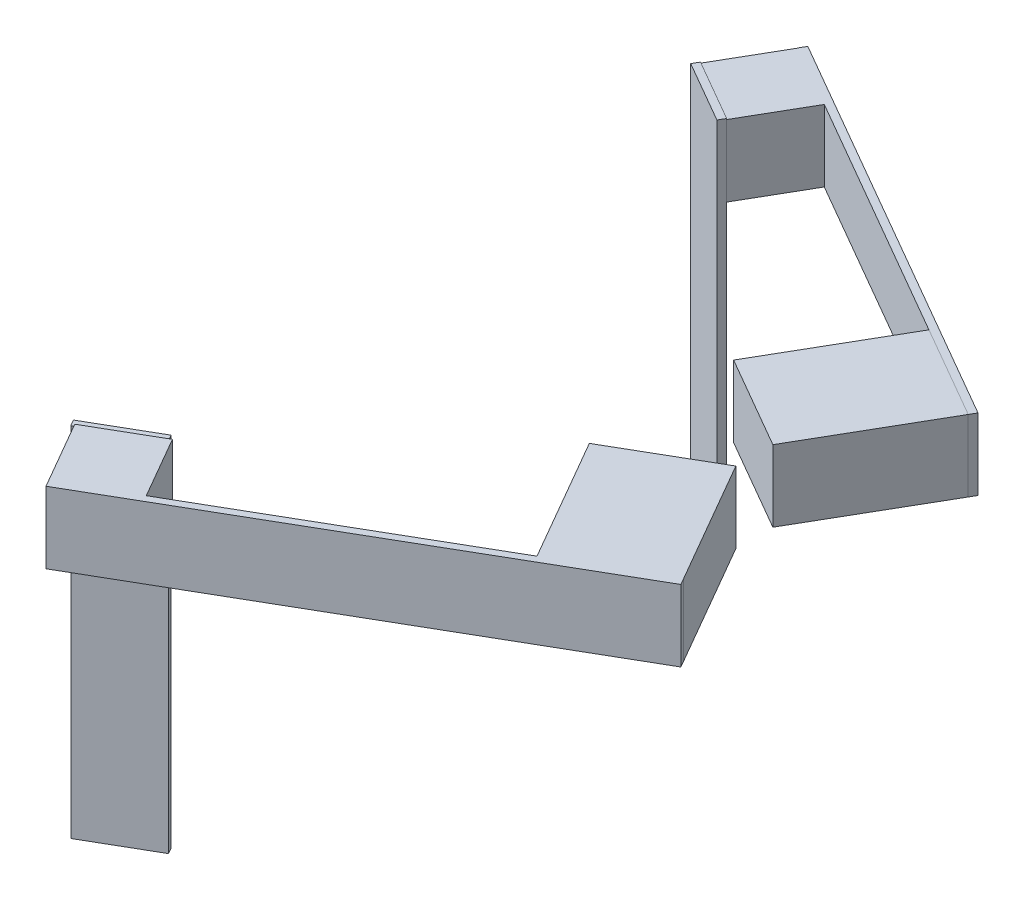
ISO-10303-21;
HEADER;
FILE_DESCRIPTION(('STEP AP214'),'2;1');
FILE_NAME('part.step','',(''),(''),'','','');
FILE_SCHEMA(('AUTOMOTIVE_DESIGN { 1 0 10303 214 1 1 1 1 }'));
ENDSEC;
DATA;
#1=APPLICATION_CONTEXT('core data for automotive mechanical design processes');
#2=APPLICATION_PROTOCOL_DEFINITION('international standard','automotive_design',2000,#1);
#3=PRODUCT_CONTEXT('',#1,'mechanical');
#4=PRODUCT('Part','Part','',(#3));
#5=PRODUCT_RELATED_PRODUCT_CATEGORY('part','',(#4));
#6=PRODUCT_DEFINITION_FORMATION('','',#4);
#7=PRODUCT_DEFINITION_CONTEXT('part definition',#1,'design');
#8=PRODUCT_DEFINITION('design','',#6,#7);
#9=PRODUCT_DEFINITION_SHAPE('','',#8);
#10=(LENGTH_UNIT() NAMED_UNIT(*) SI_UNIT(.MILLI.,.METRE.));
#11=(NAMED_UNIT(*) PLANE_ANGLE_UNIT() SI_UNIT($,.RADIAN.));
#12=(NAMED_UNIT(*) SI_UNIT($,.STERADIAN.) SOLID_ANGLE_UNIT());
#13=UNCERTAINTY_MEASURE_WITH_UNIT(LENGTH_MEASURE(1.E-05),#10,'distance_accuracy_value','');
#14=(GEOMETRIC_REPRESENTATION_CONTEXT(3) GLOBAL_UNCERTAINTY_ASSIGNED_CONTEXT((#13)) GLOBAL_UNIT_ASSIGNED_CONTEXT((#10,
#11,#12)) REPRESENTATION_CONTEXT('',''));
#15=CARTESIAN_POINT('',(0.,0.,0.));
#16=DIRECTION('',(0.,0.,1.));
#17=DIRECTION('',(1.,0.,0.));
#18=AXIS2_PLACEMENT_3D('',#15,#16,#17);
#19=CARTESIAN_POINT('',(0.00261745710183371,0.,-0.0045347872085974));
#20=DIRECTION('',(-0.499899225339609,0.,0.866083578244536));
#21=DIRECTION('',(0.866083578244536,0.,0.499899225339609));
#22=AXIS2_PLACEMENT_3D('',#19,#20,#21);
#23=PLANE('',#22);
#24=DIRECTION('',(0.866083578244536,0.,0.499899225339609));
#25=VECTOR('',#24,1.);
#26=CARTESIAN_POINT('',(-151.512166708114,0.,-87.4581306459488));
#27=LINE('',#26,#25);
#28=CARTESIAN_POINT('',(-151.512166708114,0.,-87.4581306459488));
#29=VERTEX_POINT('',#28);
#30=CARTESIAN_POINT('',(-151.475454660881,0.,-87.4369406309972));
#31=VERTEX_POINT('',#30);
#32=EDGE_CURVE('E183',#29,#31,#27,.T.);
#33=ORIENTED_EDGE('',*,*,#32,.T.);
#34=DIRECTION('',(0.,1.,0.));
#35=VECTOR('',#34,1.);
#36=CARTESIAN_POINT('',(-151.475454660881,0.,-87.4369406309972));
#37=LINE('',#36,#35);
#38=CARTESIAN_POINT('',(-151.475454660881,20.,-87.4369406309972));
#39=VERTEX_POINT('',#38);
#40=EDGE_CURVE('E12',#31,#39,#37,.T.);
#41=ORIENTED_EDGE('',*,*,#40,.T.);
#42=DIRECTION('',(-0.866083578244536,0.,-0.499899225339609));
#43=VECTOR('',#42,1.);
#44=CARTESIAN_POINT('',(-151.512166708114,20.,-87.4581306459488));
#45=LINE('',#44,#43);
#46=CARTESIAN_POINT('',(-151.512166708114,20.,-87.4581306459488));
#47=VERTEX_POINT('',#46);
#48=EDGE_CURVE('E188',#39,#47,#45,.T.);
#49=ORIENTED_EDGE('',*,*,#48,.T.);
#50=DIRECTION('',(0.,-1.,0.));
#51=VECTOR('',#50,1.);
#52=CARTESIAN_POINT('',(-151.512166708114,20.,-87.4581306459488));
#53=LINE('',#52,#51);
#54=EDGE_CURVE('E179',#47,#29,#53,.T.);
#55=ORIENTED_EDGE('',*,*,#54,.T.);
#56=EDGE_LOOP('',(#33,#41,#49,#55));
#57=FACE_BOUND('',#56,.T.);
#58=ADVANCED_FACE('F50',(#57),#23,.T.);
#59=CARTESIAN_POINT('',(-28.9701997764668,20.,-39.8199634099999));
#60=DIRECTION('',(0.499899225339609,0.,-0.866083578244536));
#61=DIRECTION('',(-0.866083578244536,0.,-0.499899225339609));
#62=AXIS2_PLACEMENT_3D('',#59,#60,#61);
#63=PLANE('',#62);
#64=DIRECTION('',(0.,-1.,0.));
#65=VECTOR('',#64,1.);
#66=CARTESIAN_POINT('',(-141.514182201321,20.,-104.77980221084));
#67=LINE('',#66,#65);
#68=CARTESIAN_POINT('',(-141.514182201321,20.,-104.77980221084));
#69=VERTEX_POINT('',#68);
#70=CARTESIAN_POINT('',(-141.514182201321,0.,-104.77980221084));
#71=VERTEX_POINT('',#70);
#72=EDGE_CURVE('E170',#69,#71,#67,.T.);
#73=ORIENTED_EDGE('',*,*,#72,.F.);
#74=DIRECTION('',(0.866083578244536,0.,0.499899225339609));
#75=VECTOR('',#74,1.);
#76=CARTESIAN_POINT('',(-28.9701997764668,20.,-39.8199634099999));
#77=LINE('',#76,#75);
#78=CARTESIAN_POINT('',(-141.561064948256,20.,-104.806862704149));
#79=VERTEX_POINT('',#78);
#80=EDGE_CURVE('E213',#79,#69,#77,.T.);
#81=ORIENTED_EDGE('',*,*,#80,.F.);
#82=DIRECTION('',(0.,-1.,0.));
#83=VECTOR('',#82,1.);
#84=CARTESIAN_POINT('',(-141.561064948256,20.,-104.806862704149));
#85=LINE('',#84,#83);
#86=CARTESIAN_POINT('',(-141.561064948256,0.,-104.806862704149));
#87=VERTEX_POINT('',#86);
#88=EDGE_CURVE('E227',#79,#87,#85,.T.);
#89=ORIENTED_EDGE('',*,*,#88,.T.);
#90=DIRECTION('',(0.866083578244536,0.,0.499899225339609));
#91=VECTOR('',#90,1.);
#92=CARTESIAN_POINT('',(-28.9701997764668,0.,-39.8199634099999));
#93=LINE('',#92,#91);
#94=EDGE_CURVE('E209',#87,#71,#93,.T.);
#95=ORIENTED_EDGE('',*,*,#94,.T.);
#96=EDGE_LOOP('',(#73,#81,#89,#95));
#97=FACE_BOUND('',#96,.T.);
#98=ADVANCED_FACE('F251',(#97),#63,.F.);
#99=DIRECTION('',(0.,1.,0.));
#100=VECTOR('',#99,1.);
#101=CARTESIAN_POINT('',(-124.192510636431,20.,-94.7818177040474));
#102=LINE('',#101,#100);
#103=CARTESIAN_POINT('',(-124.192510636431,0.,-94.7818177040474));
#104=VERTEX_POINT('',#103);
#105=CARTESIAN_POINT('',(-124.192510636431,20.,-94.7818177040474));
#106=VERTEX_POINT('',#105);
#107=EDGE_CURVE('E173',#104,#106,#102,.T.);
#108=ORIENTED_EDGE('',*,*,#107,.F.);
#109=CARTESIAN_POINT('',(-28.9701997764668,0.,-39.8199634099999));
#110=VERTEX_POINT('',#109);
#111=EDGE_CURVE('E223',#104,#110,#93,.T.);
#112=ORIENTED_EDGE('',*,*,#111,.T.);
#113=DIRECTION('',(0.,-1.,0.));
#114=VECTOR('',#113,1.);
#115=CARTESIAN_POINT('',(-28.9701997764668,20.,-39.8199634099999));
#116=LINE('',#115,#114);
#117=CARTESIAN_POINT('',(-28.9701997764668,20.,-39.8199634099999));
#118=VERTEX_POINT('',#117);
#119=EDGE_CURVE('E216',#118,#110,#116,.T.);
#120=ORIENTED_EDGE('',*,*,#119,.F.);
#121=EDGE_CURVE('E73',#106,#118,#77,.T.);
#122=ORIENTED_EDGE('',*,*,#121,.F.);
#123=EDGE_LOOP('',(#108,#112,#120,#122));
#124=FACE_BOUND('',#123,.T.);
#125=ADVANCED_FACE('F270',(#124),#63,.F.);
#126=CARTESIAN_POINT('',(-28.9701997764668,20.,-39.8199634099999));
#127=DIRECTION('',(-0.866083578244536,0.,-0.49989922533961));
#128=DIRECTION('',(-0.49989922533961,0.,0.866083578244536));
#129=AXIS2_PLACEMENT_3D('',#126,#127,#128);
#130=PLANE('',#129);
#131=DIRECTION('',(0.49989922533961,0.,-0.866083578244536));
#132=VECTOR('',#131,1.);
#133=CARTESIAN_POINT('',(-28.9701997764668,0.,-39.8199634099999));
#134=LINE('',#133,#132);
#135=CARTESIAN_POINT('',(-27.9704013257876,0.,-41.552130566489));
#136=VERTEX_POINT('',#135);
#137=EDGE_CURVE('E204',#110,#136,#134,.T.);
#138=ORIENTED_EDGE('',*,*,#137,.T.);
#139=DIRECTION('',(0.,-1.,0.));
#140=VECTOR('',#139,1.);
#141=CARTESIAN_POINT('',(-27.9704013257876,20.,-41.552130566489));
#142=LINE('',#141,#140);
#143=CARTESIAN_POINT('',(-27.9704013257876,20.,-41.552130566489));
#144=VERTEX_POINT('',#143);
#145=EDGE_CURVE('E58',#144,#136,#142,.T.);
#146=ORIENTED_EDGE('',*,*,#145,.F.);
#147=DIRECTION('',(0.49989922533961,0.,-0.866083578244536));
#148=VECTOR('',#147,1.);
#149=CARTESIAN_POINT('',(-28.9701997764668,20.,-39.8199634099999));
#150=LINE('',#149,#148);
#151=EDGE_CURVE('E205',#118,#144,#150,.T.);
#152=ORIENTED_EDGE('',*,*,#151,.F.);
#153=ORIENTED_EDGE('',*,*,#119,.T.);
#154=EDGE_LOOP('',(#138,#146,#152,#153));
#155=FACE_BOUND('',#154,.T.);
#156=ADVANCED_FACE('F52',(#155),#130,.F.);
#157=CARTESIAN_POINT('',(-27.9704013257876,20.,-41.552130566489));
#158=DIRECTION('',(-0.499899225339609,0.,0.866083578244536));
#159=DIRECTION('',(0.866083578244536,0.,0.499899225339609));
#160=AXIS2_PLACEMENT_3D('',#157,#158,#159);
#161=PLANE('',#160);
#162=DIRECTION('',(-0.866083578244535,0.,-0.499899225339609));
#163=VECTOR('',#162,1.);
#164=CARTESIAN_POINT('',(-27.9704013257876,0.,-41.552130566489));
#165=LINE('',#164,#163);
#166=CARTESIAN_POINT('',(-140.561266497577,0.,-106.539029860638));
#167=VERTEX_POINT('',#166);
#168=EDGE_CURVE('E219',#136,#167,#165,.T.);
#169=ORIENTED_EDGE('',*,*,#168,.T.);
#170=DIRECTION('',(0.,-1.,0.));
#171=VECTOR('',#170,1.);
#172=CARTESIAN_POINT('',(-140.561266497577,20.,-106.539029860638));
#173=LINE('',#172,#171);
#174=CARTESIAN_POINT('',(-140.561266497577,20.,-106.539029860638));
#175=VERTEX_POINT('',#174);
#176=EDGE_CURVE('E230',#175,#167,#173,.T.);
#177=ORIENTED_EDGE('',*,*,#176,.F.);
#178=DIRECTION('',(-0.866083578244535,0.,-0.499899225339609));
#179=VECTOR('',#178,1.);
#180=CARTESIAN_POINT('',(-27.9704013257876,20.,-41.552130566489));
#181=LINE('',#180,#179);
#182=EDGE_CURVE('E208',#144,#175,#181,.T.);
#183=ORIENTED_EDGE('',*,*,#182,.F.);
#184=ORIENTED_EDGE('',*,*,#145,.T.);
#185=EDGE_LOOP('',(#169,#177,#183,#184));
#186=FACE_BOUND('',#185,.T.);
#187=ADVANCED_FACE('F235',(#186),#161,.F.);
#188=CARTESIAN_POINT('',(-141.561064948256,20.,-104.806862704149));
#189=DIRECTION('',(0.866083578244532,0.,0.499899225339616));
#190=DIRECTION('',(0.499899225339616,0.,-0.866083578244532));
#191=AXIS2_PLACEMENT_3D('',#188,#189,#190);
#192=PLANE('',#191);
#193=DIRECTION('',(-0.499899225339616,0.,0.866083578244532));
#194=VECTOR('',#193,1.);
#195=CARTESIAN_POINT('',(-141.561064948256,0.,-104.806862704149));
#196=LINE('',#195,#194);
#197=EDGE_CURVE('E221',#167,#87,#196,.T.);
#198=ORIENTED_EDGE('',*,*,#197,.T.);
#199=ORIENTED_EDGE('',*,*,#88,.F.);
#200=DIRECTION('',(-0.499899225339616,0.,0.866083578244532));
#201=VECTOR('',#200,1.);
#202=CARTESIAN_POINT('',(-141.561064948256,20.,-104.806862704149));
#203=LINE('',#202,#201);
#204=EDGE_CURVE('E211',#175,#79,#203,.T.);
#205=ORIENTED_EDGE('',*,*,#204,.F.);
#206=ORIENTED_EDGE('',*,*,#176,.T.);
#207=EDGE_LOOP('',(#198,#199,#205,#206));
#208=FACE_BOUND('',#207,.T.);
#209=ADVANCED_FACE('F247',(#208),#192,.F.);
#210=CARTESIAN_POINT('',(0.,20.,0.));
#211=DIRECTION('',(0.,1.,0.));
#212=DIRECTION('',(0.,0.,1.));
#213=AXIS2_PLACEMENT_3D('',#210,#211,#212);
#214=PLANE('',#213);
#215=ORIENTED_EDGE('',*,*,#151,.T.);
#216=ORIENTED_EDGE('',*,*,#182,.T.);
#217=ORIENTED_EDGE('',*,*,#204,.T.);
#218=ORIENTED_EDGE('',*,*,#80,.T.);
#219=DIRECTION('',(0.499899225339609,0.,-0.866083578244536));
#220=VECTOR('',#219,1.);
#221=CARTESIAN_POINT('',(-151.512166708114,20.,-87.4581306459488));
#222=LINE('',#221,#220);
#223=EDGE_CURVE('E190',#47,#69,#222,.T.);
#224=ORIENTED_EDGE('',*,*,#223,.F.);
#225=ORIENTED_EDGE('',*,*,#48,.F.);
#226=CARTESIAN_POINT('',(-134.190495143223,20.,-77.4601461391567));
#227=VERTEX_POINT('',#226);
#228=EDGE_CURVE('E189',#227,#39,#45,.T.);
#229=ORIENTED_EDGE('',*,*,#228,.F.);
#230=DIRECTION('',(0.499899225339609,0.,-0.866083578244536));
#231=VECTOR('',#230,1.);
#232=CARTESIAN_POINT('',(-134.190495143223,20.,-77.4601461391567));
#233=LINE('',#232,#231);
#234=EDGE_CURVE('E195',#227,#106,#233,.T.);
#235=ORIENTED_EDGE('',*,*,#234,.T.);
#236=ORIENTED_EDGE('',*,*,#121,.T.);
#237=EDGE_LOOP('',(#215,#216,#217,#218,#224,#225,#229,#235,#236));
#238=FACE_BOUND('',#237,.T.);
#239=ADVANCED_FACE('F254',(#238),#214,.T.);
#240=CARTESIAN_POINT('',(0.,0.,0.));
#241=DIRECTION('',(0.,1.,0.));
#242=DIRECTION('',(0.,0.,1.));
#243=AXIS2_PLACEMENT_3D('',#240,#241,#242);
#244=PLANE('',#243);
#245=ORIENTED_EDGE('',*,*,#137,.F.);
#246=ORIENTED_EDGE('',*,*,#111,.F.);
#247=DIRECTION('',(0.499899225339609,0.,-0.866083578244536));
#248=VECTOR('',#247,1.);
#249=CARTESIAN_POINT('',(-134.190495143223,0.,-77.4601461391567));
#250=LINE('',#249,#248);
#251=CARTESIAN_POINT('',(-134.190495143223,0.,-77.4601461391567));
#252=VERTEX_POINT('',#251);
#253=EDGE_CURVE('E198',#252,#104,#250,.T.);
#254=ORIENTED_EDGE('',*,*,#253,.F.);
#255=EDGE_CURVE('E182',#31,#252,#27,.T.);
#256=ORIENTED_EDGE('',*,*,#255,.F.);
#257=ORIENTED_EDGE('',*,*,#32,.F.);
#258=DIRECTION('',(0.499899225339609,0.,-0.866083578244536));
#259=VECTOR('',#258,1.);
#260=CARTESIAN_POINT('',(-151.512166708114,0.,-87.4581306459488));
#261=LINE('',#260,#259);
#262=EDGE_CURVE('E201',#29,#71,#261,.T.);
#263=ORIENTED_EDGE('',*,*,#262,.T.);
#264=ORIENTED_EDGE('',*,*,#94,.F.);
#265=ORIENTED_EDGE('',*,*,#197,.F.);
#266=ORIENTED_EDGE('',*,*,#168,.F.);
#267=EDGE_LOOP('',(#245,#246,#254,#256,#257,#263,#264,#265,#266));
#268=FACE_BOUND('',#267,.T.);
#269=ADVANCED_FACE('F241',(#268),#244,.F.);
#270=CARTESIAN_POINT('',(-151.512166708114,20.,-87.4581306459488));
#271=DIRECTION('',(0.866083578244536,0.,0.499899225339609));
#272=DIRECTION('',(0.499899225339609,0.,-0.866083578244536));
#273=AXIS2_PLACEMENT_3D('',#270,#271,#272);
#274=PLANE('',#273);
#275=ORIENTED_EDGE('',*,*,#72,.T.);
#276=ORIENTED_EDGE('',*,*,#262,.F.);
#277=ORIENTED_EDGE('',*,*,#54,.F.);
#278=ORIENTED_EDGE('',*,*,#223,.T.);
#279=EDGE_LOOP('',(#275,#276,#277,#278));
#280=FACE_BOUND('',#279,.T.);
#281=ADVANCED_FACE('F258',(#280),#274,.F.);
#282=CARTESIAN_POINT('',(-134.190495143223,20.,-77.4601461391567));
#283=DIRECTION('',(-0.866083578244536,0.,-0.499899225339609));
#284=DIRECTION('',(-0.499899225339609,0.,0.866083578244536));
#285=AXIS2_PLACEMENT_3D('',#282,#283,#284);
#286=PLANE('',#285);
#287=ORIENTED_EDGE('',*,*,#107,.T.);
#288=ORIENTED_EDGE('',*,*,#234,.F.);
#289=DIRECTION('',(0.,1.,0.));
#290=VECTOR('',#289,1.);
#291=CARTESIAN_POINT('',(-134.190495143223,20.,-77.4601461391567));
#292=LINE('',#291,#290);
#293=EDGE_CURVE('E186',#252,#227,#292,.T.);
#294=ORIENTED_EDGE('',*,*,#293,.F.);
#295=ORIENTED_EDGE('',*,*,#253,.T.);
#296=EDGE_LOOP('',(#287,#288,#294,#295));
#297=FACE_BOUND('',#296,.T.);
#298=ADVANCED_FACE('F269',(#297),#286,.F.);
#299=CARTESIAN_POINT('',(-152.47525311156,20.2893466400318,-85.7047734745081));
#300=DIRECTION('',(0.866083578244536,0.,0.499899225339609));
#301=DIRECTION('',(0.499899225339609,0.,-0.866083578244536));
#302=AXIS2_PLACEMENT_3D('',#299,#300,#301);
#303=PLANE('',#302);
#304=DIRECTION('',(0.,-1.,0.));
#305=VECTOR('',#304,1.);
#306=CARTESIAN_POINT('',(-151.475454660881,20.2893466400318,-87.4369406309972));
#307=LINE('',#306,#305);
#308=CARTESIAN_POINT('',(-151.475454660881,20.2893466400318,-87.4369406309972));
#309=VERTEX_POINT('',#308);
#310=EDGE_CURVE('E65',#309,#39,#307,.T.);
#311=ORIENTED_EDGE('',*,*,#310,.T.);
#312=ORIENTED_EDGE('',*,*,#40,.F.);
#313=CARTESIAN_POINT('',(-151.475454660881,-79.7106533599683,-87.4369406309972));
#314=VERTEX_POINT('',#313);
#315=EDGE_CURVE('E168',#31,#314,#307,.T.);
#316=ORIENTED_EDGE('',*,*,#315,.T.);
#317=DIRECTION('',(0.499899225339609,0.,-0.866083578244536));
#318=VECTOR('',#317,1.);
#319=CARTESIAN_POINT('',(-152.47525311156,-79.7106533599683,-85.7047734745081));
#320=LINE('',#319,#318);
#321=CARTESIAN_POINT('',(-152.47525311156,-79.7106533599683,-85.7047734745081));
#322=VERTEX_POINT('',#321);
#323=EDGE_CURVE('E152',#322,#314,#320,.T.);
#324=ORIENTED_EDGE('',*,*,#323,.F.);
#325=DIRECTION('',(0.,-1.,0.));
#326=VECTOR('',#325,1.);
#327=CARTESIAN_POINT('',(-152.47525311156,20.2893466400318,-85.7047734745081));
#328=LINE('',#327,#326);
#329=CARTESIAN_POINT('',(-152.47525311156,20.2893466400318,-85.7047734745081));
#330=VERTEX_POINT('',#329);
#331=EDGE_CURVE('E158',#330,#322,#328,.T.);
#332=ORIENTED_EDGE('',*,*,#331,.F.);
#333=DIRECTION('',(0.499899225339609,0.,-0.866083578244536));
#334=VECTOR('',#333,1.);
#335=CARTESIAN_POINT('',(-152.47525311156,20.2893466400318,-85.7047734745081));
#336=LINE('',#335,#334);
#337=EDGE_CURVE('E355',#330,#309,#336,.T.);
#338=ORIENTED_EDGE('',*,*,#337,.T.);
#339=EDGE_LOOP('',(#311,#312,#316,#324,#332,#338));
#340=FACE_BOUND('',#339,.T.);
#341=ADVANCED_FACE('F167',(#340),#303,.F.);
#342=CARTESIAN_POINT('',(-152.47525311156,-79.7106533599683,-85.7047734745081));
#343=DIRECTION('',(0.,1.,0.));
#344=DIRECTION('',(0.,0.,1.));
#345=AXIS2_PLACEMENT_3D('',#342,#343,#344);
#346=PLANE('',#345);
#347=DIRECTION('',(0.866083578244536,0.,0.499899225339609));
#348=VECTOR('',#347,1.);
#349=CARTESIAN_POINT('',(-151.475454660881,-79.7106533599683,-87.4369406309972));
#350=LINE('',#349,#348);
#351=CARTESIAN_POINT('',(-134.15378309599,-79.7106533599683,-77.438956124205));
#352=VERTEX_POINT('',#351);
#353=EDGE_CURVE('E364',#314,#352,#350,.T.);
#354=ORIENTED_EDGE('',*,*,#353,.T.);
#355=DIRECTION('',(0.499899225339609,0.,-0.866083578244536));
#356=VECTOR('',#355,1.);
#357=CARTESIAN_POINT('',(-135.153581546669,-79.7106533599683,-75.706788967716));
#358=LINE('',#357,#356);
#359=CARTESIAN_POINT('',(-135.153581546669,-79.7106533599683,-75.706788967716));
#360=VERTEX_POINT('',#359);
#361=EDGE_CURVE('E154',#360,#352,#358,.T.);
#362=ORIENTED_EDGE('',*,*,#361,.F.);
#363=DIRECTION('',(0.866083578244536,0.,0.499899225339609));
#364=VECTOR('',#363,1.);
#365=CARTESIAN_POINT('',(-152.47525311156,-79.7106533599683,-85.7047734745081));
#366=LINE('',#365,#364);
#367=EDGE_CURVE('E148',#322,#360,#366,.T.);
#368=ORIENTED_EDGE('',*,*,#367,.F.);
#369=ORIENTED_EDGE('',*,*,#323,.T.);
#370=EDGE_LOOP('',(#354,#362,#368,#369));
#371=FACE_BOUND('',#370,.T.);
#372=ADVANCED_FACE('F150',(#371),#346,.F.);
#373=CARTESIAN_POINT('',(-135.153581546669,20.2893466400318,-75.706788967716));
#374=DIRECTION('',(-0.866083578244536,0.,-0.499899225339609));
#375=DIRECTION('',(-0.499899225339609,0.,0.866083578244536));
#376=AXIS2_PLACEMENT_3D('',#373,#374,#375);
#377=PLANE('',#376);
#378=DIRECTION('',(0.,1.,0.));
#379=VECTOR('',#378,1.);
#380=CARTESIAN_POINT('',(-134.15378309599,20.2893466400318,-77.438956124205));
#381=LINE('',#380,#379);
#382=CARTESIAN_POINT('',(-134.15378309599,20.2893466400318,-77.438956124205));
#383=VERTEX_POINT('',#382);
#384=EDGE_CURVE('E358',#352,#383,#381,.T.);
#385=ORIENTED_EDGE('',*,*,#384,.T.);
#386=DIRECTION('',(0.499899225339609,0.,-0.866083578244536));
#387=VECTOR('',#386,1.);
#388=CARTESIAN_POINT('',(-135.153581546669,20.2893466400318,-75.706788967716));
#389=LINE('',#388,#387);
#390=CARTESIAN_POINT('',(-135.153581546669,20.2893466400318,-75.706788967716));
#391=VERTEX_POINT('',#390);
#392=EDGE_CURVE('E175',#391,#383,#389,.T.);
#393=ORIENTED_EDGE('',*,*,#392,.F.);
#394=DIRECTION('',(0.,1.,0.));
#395=VECTOR('',#394,1.);
#396=CARTESIAN_POINT('',(-135.153581546669,20.2893466400318,-75.706788967716));
#397=LINE('',#396,#395);
#398=EDGE_CURVE('E157',#360,#391,#397,.T.);
#399=ORIENTED_EDGE('',*,*,#398,.F.);
#400=ORIENTED_EDGE('',*,*,#361,.T.);
#401=EDGE_LOOP('',(#385,#393,#399,#400));
#402=FACE_BOUND('',#401,.T.);
#403=ADVANCED_FACE('F316',(#402),#377,.F.);
#404=CARTESIAN_POINT('',(-152.47525311156,20.2893466400318,-85.7047734745081));
#405=DIRECTION('',(0.,-1.,0.));
#406=DIRECTION('',(0.,0.,-1.));
#407=AXIS2_PLACEMENT_3D('',#404,#405,#406);
#408=PLANE('',#407);
#409=DIRECTION('',(-0.866083578244536,0.,-0.499899225339609));
#410=VECTOR('',#409,1.);
#411=CARTESIAN_POINT('',(-151.475454660881,20.2893466400318,-87.4369406309972));
#412=LINE('',#411,#410);
#413=EDGE_CURVE('E165',#383,#309,#412,.T.);
#414=ORIENTED_EDGE('',*,*,#413,.T.);
#415=ORIENTED_EDGE('',*,*,#337,.F.);
#416=DIRECTION('',(-0.866083578244536,0.,-0.499899225339609));
#417=VECTOR('',#416,1.);
#418=CARTESIAN_POINT('',(-152.47525311156,20.2893466400318,-85.7047734745081));
#419=LINE('',#418,#417);
#420=EDGE_CURVE('E163',#391,#330,#419,.T.);
#421=ORIENTED_EDGE('',*,*,#420,.F.);
#422=ORIENTED_EDGE('',*,*,#392,.T.);
#423=EDGE_LOOP('',(#414,#415,#421,#422));
#424=FACE_BOUND('',#423,.T.);
#425=ADVANCED_FACE('F324',(#424),#408,.F.);
#426=CARTESIAN_POINT('',(-0.997180993577389,0.,1.72763236928048));
#427=DIRECTION('',(-0.499899225339609,0.,0.866083578244536));
#428=DIRECTION('',(0.866083578244536,0.,0.499899225339609));
#429=AXIS2_PLACEMENT_3D('',#426,#427,#428);
#430=PLANE('',#429);
#431=ORIENTED_EDGE('',*,*,#331,.T.);
#432=ORIENTED_EDGE('',*,*,#367,.T.);
#433=ORIENTED_EDGE('',*,*,#398,.T.);
#434=ORIENTED_EDGE('',*,*,#420,.T.);
#435=EDGE_LOOP('',(#431,#432,#433,#434));
#436=FACE_BOUND('',#435,.T.);
#437=ADVANCED_FACE('F161',(#436),#430,.T.);
#438=CARTESIAN_POINT('',(0.00261745710182907,0.,-0.00453478720858917));
#439=DIRECTION('',(-0.499899225339609,0.,0.866083578244536));
#440=DIRECTION('',(0.866083578244536,0.,0.499899225339609));
#441=AXIS2_PLACEMENT_3D('',#438,#439,#440);
#442=PLANE('',#441);
#443=ORIENTED_EDGE('',*,*,#228,.T.);
#444=ORIENTED_EDGE('',*,*,#310,.F.);
#445=ORIENTED_EDGE('',*,*,#413,.F.);
#446=ORIENTED_EDGE('',*,*,#384,.F.);
#447=ORIENTED_EDGE('',*,*,#353,.F.);
#448=ORIENTED_EDGE('',*,*,#315,.F.);
#449=ORIENTED_EDGE('',*,*,#255,.T.);
#450=ORIENTED_EDGE('',*,*,#293,.T.);
#451=EDGE_LOOP('',(#443,#444,#445,#446,#447,#448,#449,#450));
#452=FACE_BOUND('',#451,.T.);
#453=ADVANCED_FACE('F264',(#452),#442,.F.);
#454=CLOSED_SHELL('',(#58,#98,#125,#156,#187,#209,#239,#269,#281,#298,#341,#372,#403,#425,#437,#453));
#455=MANIFOLD_SOLID_BREP('B2',#454);
#456=CARTESIAN_POINT('',(-48.9701997764668,20.,-5.1789472586224));
#457=DIRECTION('',(-0.866025403784439,0.,-0.5));
#458=DIRECTION('',(-0.5,0.,0.866025403784439));
#459=AXIS2_PLACEMENT_3D('',#456,#457,#458);
#460=PLANE('',#459);
#461=DIRECTION('',(0.5,0.,-0.866025403784439));
#462=VECTOR('',#461,1.);
#463=CARTESIAN_POINT('',(-48.9701997764668,0.,-5.1789472586224));
#464=LINE('',#463,#462);
#465=CARTESIAN_POINT('',(-48.9701997764668,0.,-5.1789472586224));
#466=VERTEX_POINT('',#465);
#467=CARTESIAN_POINT('',(-28.9701997764668,0.,-39.8199634099999));
#468=VERTEX_POINT('',#467);
#469=EDGE_CURVE('E493',#466,#468,#464,.T.);
#470=ORIENTED_EDGE('',*,*,#469,.T.);
#471=DIRECTION('',(0.,-1.,0.));
#472=VECTOR('',#471,1.);
#473=CARTESIAN_POINT('',(-28.9701997764668,20.,-39.8199634099999));
#474=LINE('',#473,#472);
#475=CARTESIAN_POINT('',(-28.9701997764668,20.,-39.8199634099999));
#476=VERTEX_POINT('',#475);
#477=EDGE_CURVE('E48',#476,#468,#474,.T.);
#478=ORIENTED_EDGE('',*,*,#477,.F.);
#479=DIRECTION('',(0.5,0.,-0.866025403784439));
#480=VECTOR('',#479,1.);
#481=CARTESIAN_POINT('',(-48.9701997764668,20.,-5.1789472586224));
#482=LINE('',#481,#480);
#483=CARTESIAN_POINT('',(-48.9701997764668,20.,-5.1789472586224));
#484=VERTEX_POINT('',#483);
#485=EDGE_CURVE('E481',#484,#476,#482,.T.);
#486=ORIENTED_EDGE('',*,*,#485,.F.);
#487=DIRECTION('',(0.,-1.,0.));
#488=VECTOR('',#487,1.);
#489=CARTESIAN_POINT('',(-48.9701997764668,20.,-5.1789472586224));
#490=LINE('',#489,#488);
#491=EDGE_CURVE('E489',#484,#466,#490,.T.);
#492=ORIENTED_EDGE('',*,*,#491,.T.);
#493=EDGE_LOOP('',(#470,#478,#486,#492));
#494=FACE_BOUND('',#493,.T.);
#495=ADVANCED_FACE('F430',(#494),#460,.F.);
#496=CARTESIAN_POINT('',(-28.9701997764668,20.,-39.8199634099999));
#497=DIRECTION('',(-0.5,0.,0.866025403784439));
#498=DIRECTION('',(0.866025403784439,0.,0.5));
#499=AXIS2_PLACEMENT_3D('',#496,#497,#498);
#500=PLANE('',#499);
#501=DIRECTION('',(-0.866025403784439,0.,-0.5));
#502=VECTOR('',#501,1.);
#503=CARTESIAN_POINT('',(-28.9701997764668,0.,-39.8199634099999));
#504=LINE('',#503,#502);
#505=CARTESIAN_POINT('',(-54.95096189,0.,-54.8199634099999));
#506=VERTEX_POINT('',#505);
#507=EDGE_CURVE('E485',#468,#506,#504,.T.);
#508=ORIENTED_EDGE('',*,*,#507,.T.);
#509=DIRECTION('',(0.,-1.,0.));
#510=VECTOR('',#509,1.);
#511=CARTESIAN_POINT('',(-54.95096189,20.,-54.8199634099999));
#512=LINE('',#511,#510);
#513=CARTESIAN_POINT('',(-54.95096189,20.,-54.8199634099999));
#514=VERTEX_POINT('',#513);
#515=EDGE_CURVE('E438',#514,#506,#512,.T.);
#516=ORIENTED_EDGE('',*,*,#515,.F.);
#517=DIRECTION('',(-0.866025403784439,0.,-0.5));
#518=VECTOR('',#517,1.);
#519=CARTESIAN_POINT('',(-28.9701997764668,20.,-39.8199634099999));
#520=LINE('',#519,#518);
#521=EDGE_CURVE('E476',#476,#514,#520,.T.);
#522=ORIENTED_EDGE('',*,*,#521,.F.);
#523=ORIENTED_EDGE('',*,*,#477,.T.);
#524=EDGE_LOOP('',(#508,#516,#522,#523));
#525=FACE_BOUND('',#524,.T.);
#526=ADVANCED_FACE('F484',(#525),#500,.F.);
#527=CARTESIAN_POINT('',(-74.9509618899999,20.,-20.1789472586223));
#528=DIRECTION('',(0.866025403784439,0.,0.499999999999999));
#529=DIRECTION('',(0.499999999999999,0.,-0.866025403784439));
#530=AXIS2_PLACEMENT_3D('',#527,#528,#529);
#531=PLANE('',#530);
#532=DIRECTION('',(-0.499999999999999,0.,0.866025403784439));
#533=VECTOR('',#532,1.);
#534=CARTESIAN_POINT('',(-74.9509618899999,0.,-20.1789472586223));
#535=LINE('',#534,#533);
#536=CARTESIAN_POINT('',(-74.9509618899999,0.,-20.1789472586223));
#537=VERTEX_POINT('',#536);
#538=EDGE_CURVE('E463',#506,#537,#535,.T.);
#539=ORIENTED_EDGE('',*,*,#538,.T.);
#540=DIRECTION('',(0.,-1.,0.));
#541=VECTOR('',#540,1.);
#542=CARTESIAN_POINT('',(-74.9509618899999,20.,-20.1789472586223));
#543=LINE('',#542,#541);
#544=CARTESIAN_POINT('',(-74.9509618899999,20.,-20.1789472586223));
#545=VERTEX_POINT('',#544);
#546=EDGE_CURVE('E486',#545,#537,#543,.T.);
#547=ORIENTED_EDGE('',*,*,#546,.F.);
#548=DIRECTION('',(-0.499999999999999,0.,0.866025403784439));
#549=VECTOR('',#548,1.);
#550=CARTESIAN_POINT('',(-74.9509618899999,20.,-20.1789472586223));
#551=LINE('',#550,#549);
#552=EDGE_CURVE('E479',#514,#545,#551,.T.);
#553=ORIENTED_EDGE('',*,*,#552,.F.);
#554=ORIENTED_EDGE('',*,*,#515,.T.);
#555=EDGE_LOOP('',(#539,#547,#553,#554));
#556=FACE_BOUND('',#555,.T.);
#557=ADVANCED_FACE('F487',(#556),#531,.F.);
#558=CARTESIAN_POINT('',(-48.9701997764668,20.,-5.1789472586224));
#559=DIRECTION('',(0.499999999999999,0.,-0.866025403784439));
#560=DIRECTION('',(-0.866025403784439,0.,-0.499999999999999));
#561=AXIS2_PLACEMENT_3D('',#558,#559,#560);
#562=PLANE('',#561);
#563=DIRECTION('',(0.866025403784439,0.,0.499999999999999));
#564=VECTOR('',#563,1.);
#565=CARTESIAN_POINT('',(-48.9701997764668,0.,-5.1789472586224));
#566=LINE('',#565,#564);
#567=EDGE_CURVE('E469',#537,#466,#566,.T.);
#568=ORIENTED_EDGE('',*,*,#567,.T.);
#569=ORIENTED_EDGE('',*,*,#491,.F.);
#570=DIRECTION('',(0.866025403784439,0.,0.499999999999999));
#571=VECTOR('',#570,1.);
#572=CARTESIAN_POINT('',(-48.9701997764668,20.,-5.1789472586224));
#573=LINE('',#572,#571);
#574=EDGE_CURVE('E446',#545,#484,#573,.T.);
#575=ORIENTED_EDGE('',*,*,#574,.F.);
#576=ORIENTED_EDGE('',*,*,#546,.T.);
#577=EDGE_LOOP('',(#568,#569,#575,#576));
#578=FACE_BOUND('',#577,.T.);
#579=ADVANCED_FACE('F500',(#578),#562,.F.);
#580=CARTESIAN_POINT('',(0.,20.,0.));
#581=DIRECTION('',(0.,1.,0.));
#582=DIRECTION('',(0.,0.,1.));
#583=AXIS2_PLACEMENT_3D('',#580,#581,#582);
#584=PLANE('',#583);
#585=ORIENTED_EDGE('',*,*,#485,.T.);
#586=ORIENTED_EDGE('',*,*,#521,.T.);
#587=ORIENTED_EDGE('',*,*,#552,.T.);
#588=ORIENTED_EDGE('',*,*,#574,.T.);
#589=EDGE_LOOP('',(#585,#586,#587,#588));
#590=FACE_BOUND('',#589,.T.);
#591=ADVANCED_FACE('F477',(#590),#584,.T.);
#592=CARTESIAN_POINT('',(0.,0.,0.));
#593=DIRECTION('',(0.,1.,0.));
#594=DIRECTION('',(0.,0.,1.));
#595=AXIS2_PLACEMENT_3D('',#592,#593,#594);
#596=PLANE('',#595);
#597=ORIENTED_EDGE('',*,*,#469,.F.);
#598=ORIENTED_EDGE('',*,*,#567,.F.);
#599=ORIENTED_EDGE('',*,*,#538,.F.);
#600=ORIENTED_EDGE('',*,*,#507,.F.);
#601=EDGE_LOOP('',(#597,#598,#599,#600));
#602=FACE_BOUND('',#601,.T.);
#603=ADVANCED_FACE('F503',(#602),#596,.F.);
#604=CLOSED_SHELL('',(#495,#526,#557,#579,#591,#603));
#605=MANIFOLD_SOLID_BREP('B6',#604);
#606=CARTESIAN_POINT('',(0.00104073773890372,0.,0.0018028032359764));
#607=DIRECTION('',(-0.499959936859134,0.,-0.866048533014063));
#608=DIRECTION('',(-0.866048533014063,0.,0.499959936859134));
#609=AXIS2_PLACEMENT_3D('',#606,#607,#608);
#610=PLANE('',#609);
#611=DIRECTION('',(-0.866048533014063,0.,0.499959936859134));
#612=VECTOR('',#611,1.);
#613=CARTESIAN_POINT('',(-134.23473714952,0.,77.494585803725));
#614=LINE('',#613,#612);
#615=CARTESIAN_POINT('',(-134.23473714952,0.,77.494585803725));
#616=VERTEX_POINT('',#615);
#617=CARTESIAN_POINT('',(-134.939423795444,0.,77.9013933642385));
#618=VERTEX_POINT('',#617);
#619=EDGE_CURVE('E699',#616,#618,#614,.T.);
#620=ORIENTED_EDGE('',*,*,#619,.T.);
#621=DIRECTION('',(0.,-1.,0.));
#622=VECTOR('',#621,1.);
#623=CARTESIAN_POINT('',(-134.939423795444,19.4937328515461,77.9013933642385));
#624=LINE('',#623,#622);
#625=CARTESIAN_POINT('',(-134.939423795444,19.4937328515461,77.9013933642385));
#626=VERTEX_POINT('',#625);
#627=EDGE_CURVE('E825',#626,#618,#624,.T.);
#628=ORIENTED_EDGE('',*,*,#627,.F.);
#629=DIRECTION('',(-0.866048533014063,0.,0.499959936859134));
#630=VECTOR('',#629,1.);
#631=CARTESIAN_POINT('',(0.00104073773890372,19.4937328515461,0.0018028032359764));
#632=LINE('',#631,#630);
#633=CARTESIAN_POINT('',(-151.555707809801,19.4937328515461,87.4937845409077));
#634=VERTEX_POINT('',#633);
#635=EDGE_CURVE('E428',#626,#634,#632,.T.);
#636=ORIENTED_EDGE('',*,*,#635,.T.);
#637=DIRECTION('',(0.,1.,0.));
#638=VECTOR('',#637,1.);
#639=CARTESIAN_POINT('',(-151.555707809801,20.,87.4937845409077));
#640=LINE('',#639,#638);
#641=CARTESIAN_POINT('',(-151.555707809801,20.,87.4937845409077));
#642=VERTEX_POINT('',#641);
#643=EDGE_CURVE('E703',#634,#642,#640,.T.);
#644=ORIENTED_EDGE('',*,*,#643,.T.);
#645=DIRECTION('',(0.866048533014063,0.,-0.499959936859134));
#646=VECTOR('',#645,1.);
#647=CARTESIAN_POINT('',(-134.23473714952,20.,77.494585803725));
#648=LINE('',#647,#646);
#649=CARTESIAN_POINT('',(-134.23473714952,20.,77.494585803725));
#650=VERTEX_POINT('',#649);
#651=EDGE_CURVE('E707',#642,#650,#648,.T.);
#652=ORIENTED_EDGE('',*,*,#651,.T.);
#653=DIRECTION('',(0.,-1.,0.));
#654=VECTOR('',#653,1.);
#655=CARTESIAN_POINT('',(-134.23473714952,20.,77.494585803725));
#656=LINE('',#655,#654);
#657=EDGE_CURVE('E689',#650,#616,#656,.T.);
#658=ORIENTED_EDGE('',*,*,#657,.T.);
#659=EDGE_LOOP('',(#620,#628,#636,#644,#652,#658));
#660=FACE_BOUND('',#659,.T.);
#661=ADVANCED_FACE('F553',(#660),#610,.T.);
#662=CARTESIAN_POINT('',(-28.9701997807902,20.,39.8199634095015));
#663=DIRECTION('',(0.499959936859134,0.,0.866048533014063));
#664=DIRECTION('',(0.866048533014063,0.,-0.499959936859134));
#665=AXIS2_PLACEMENT_3D('',#662,#663,#664);
#666=PLANE('',#665);
#667=DIRECTION('',(0.,-1.,0.));
#668=VECTOR('',#667,1.);
#669=CARTESIAN_POINT('',(-124.235538412337,20.,94.8155564640063));
#670=LINE('',#669,#668);
#671=CARTESIAN_POINT('',(-124.235538412337,20.,94.8155564640063));
#672=VERTEX_POINT('',#671);
#673=CARTESIAN_POINT('',(-124.235538412337,0.,94.8155564640063));
#674=VERTEX_POINT('',#673);
#675=EDGE_CURVE('E684',#672,#674,#670,.T.);
#676=ORIENTED_EDGE('',*,*,#675,.F.);
#677=DIRECTION('',(-0.866048533014063,0.,0.499959936859134));
#678=VECTOR('',#677,1.);
#679=CARTESIAN_POINT('',(-28.9701997807902,20.,39.8199634095015));
#680=LINE('',#679,#678);
#681=CARTESIAN_POINT('',(-54.9516557990124,20.,54.8187615313244));
#682=VERTEX_POINT('',#681);
#683=EDGE_CURVE('E721',#682,#672,#680,.T.);
#684=ORIENTED_EDGE('',*,*,#683,.F.);
#685=DIRECTION('',(0.,-1.,0.));
#686=VECTOR('',#685,1.);
#687=CARTESIAN_POINT('',(-54.9516557990124,20.,54.8187615313243));
#688=LINE('',#687,#686);
#689=CARTESIAN_POINT('',(-54.9516557990124,0.,54.8187615313244));
#690=VERTEX_POINT('',#689);
#691=EDGE_CURVE('E577',#682,#690,#688,.T.);
#692=ORIENTED_EDGE('',*,*,#691,.T.);
#693=DIRECTION('',(-0.866048533014063,0.,0.499959936859134));
#694=VECTOR('',#693,1.);
#695=CARTESIAN_POINT('',(-28.9701997807902,0.,39.8199634095015));
#696=LINE('',#695,#694);
#697=EDGE_CURVE('E736',#690,#674,#696,.T.);
#698=ORIENTED_EDGE('',*,*,#697,.T.);
#699=EDGE_LOOP('',(#676,#684,#692,#698));
#700=FACE_BOUND('',#699,.T.);
#701=ADVANCED_FACE('F799',(#700),#666,.F.);
#702=CARTESIAN_POINT('',(-74.9509618943233,20.,20.1789472581239));
#703=DIRECTION('',(0.866025403784439,0.,-0.5));
#704=DIRECTION('',(-0.5,0.,-0.866025403784439));
#705=AXIS2_PLACEMENT_3D('',#702,#703,#704);
#706=PLANE('',#705);
#707=ORIENTED_EDGE('',*,*,#691,.F.);
#708=DIRECTION('',(0.5,0.,0.866025403784439));
#709=VECTOR('',#708,1.);
#710=CARTESIAN_POINT('',(-74.9509618943233,20.,20.1789472581239));
#711=LINE('',#710,#709);
#712=CARTESIAN_POINT('',(-74.9509618943233,20.,20.1789472581239));
#713=VERTEX_POINT('',#712);
#714=EDGE_CURVE('E763',#713,#682,#711,.T.);
#715=ORIENTED_EDGE('',*,*,#714,.F.);
#716=DIRECTION('',(0.,-1.,0.));
#717=VECTOR('',#716,1.);
#718=CARTESIAN_POINT('',(-74.9509618943233,20.,20.1789472581239));
#719=LINE('',#718,#717);
#720=CARTESIAN_POINT('',(-74.9509618943233,0.,20.1789472581239));
#721=VERTEX_POINT('',#720);
#722=EDGE_CURVE('E778',#713,#721,#719,.T.);
#723=ORIENTED_EDGE('',*,*,#722,.T.);
#724=DIRECTION('',(0.5,0.,0.866025403784439));
#725=VECTOR('',#724,1.);
#726=CARTESIAN_POINT('',(-74.9509618943233,0.,20.1789472581239));
#727=LINE('',#726,#725);
#728=EDGE_CURVE('E760',#721,#690,#727,.T.);
#729=ORIENTED_EDGE('',*,*,#728,.T.);
#730=EDGE_LOOP('',(#707,#715,#723,#729));
#731=FACE_BOUND('',#730,.T.);
#732=ADVANCED_FACE('F795',(#731),#706,.F.);
#733=CARTESIAN_POINT('',(-48.9701997807902,20.,5.17894725812393));
#734=DIRECTION('',(-0.866025403784438,0.,0.5));
#735=DIRECTION('',(0.500000000000001,0.,0.866025403784438));
#736=AXIS2_PLACEMENT_3D('',#733,#734,#735);
#737=PLANE('',#736);
#738=DIRECTION('',(-0.5,0.,-0.866025403784438));
#739=VECTOR('',#738,1.);
#740=CARTESIAN_POINT('',(-48.9701997807902,0.,5.17894725812393));
#741=LINE('',#740,#739);
#742=CARTESIAN_POINT('',(-28.9701997807902,0.,39.8199634095015));
#743=VERTEX_POINT('',#742);
#744=CARTESIAN_POINT('',(-48.9701997807902,0.,5.17894725812393));
#745=VERTEX_POINT('',#744);
#746=EDGE_CURVE('E754',#743,#745,#741,.T.);
#747=ORIENTED_EDGE('',*,*,#746,.T.);
#748=DIRECTION('',(0.,-1.,0.));
#749=VECTOR('',#748,1.);
#750=CARTESIAN_POINT('',(-48.9701997807902,20.,5.17894725812393));
#751=LINE('',#750,#749);
#752=CARTESIAN_POINT('',(-48.9701997807902,20.,5.17894725812393));
#753=VERTEX_POINT('',#752);
#754=EDGE_CURVE('E562',#753,#745,#751,.T.);
#755=ORIENTED_EDGE('',*,*,#754,.F.);
#756=DIRECTION('',(-0.5,0.,-0.866025403784438));
#757=VECTOR('',#756,1.);
#758=CARTESIAN_POINT('',(-48.9701997807902,20.,5.17894725812393));
#759=LINE('',#758,#757);
#760=CARTESIAN_POINT('',(-28.9701997807902,20.,39.8199634095015));
#761=VERTEX_POINT('',#760);
#762=EDGE_CURVE('E755',#761,#753,#759,.T.);
#763=ORIENTED_EDGE('',*,*,#762,.F.);
#764=DIRECTION('',(0.,-1.,0.));
#765=VECTOR('',#764,1.);
#766=CARTESIAN_POINT('',(-28.9701997807902,20.,39.8199634095015));
#767=LINE('',#766,#765);
#768=EDGE_CURVE('E766',#761,#743,#767,.T.);
#769=ORIENTED_EDGE('',*,*,#768,.T.);
#770=EDGE_LOOP('',(#747,#755,#763,#769));
#771=FACE_BOUND('',#770,.T.);
#772=ADVANCED_FACE('F555',(#771),#737,.F.);
#773=CARTESIAN_POINT('',(-48.9701997807902,20.,5.17894725812393));
#774=DIRECTION('',(0.500000000000001,0.,0.866025403784438));
#775=DIRECTION('',(0.866025403784438,0.,-0.500000000000001));
#776=AXIS2_PLACEMENT_3D('',#773,#774,#775);
#777=PLANE('',#776);
#778=DIRECTION('',(-0.866025403784438,0.,0.500000000000001));
#779=VECTOR('',#778,1.);
#780=CARTESIAN_POINT('',(-48.9701997807902,0.,5.17894725812393));
#781=LINE('',#780,#779);
#782=EDGE_CURVE('E770',#745,#721,#781,.T.);
#783=ORIENTED_EDGE('',*,*,#782,.T.);
#784=ORIENTED_EDGE('',*,*,#722,.F.);
#785=DIRECTION('',(-0.866025403784438,0.,0.500000000000001));
#786=VECTOR('',#785,1.);
#787=CARTESIAN_POINT('',(-48.9701997807902,20.,5.17894725812393));
#788=LINE('',#787,#786);
#789=EDGE_CURVE('E759',#753,#713,#788,.T.);
#790=ORIENTED_EDGE('',*,*,#789,.F.);
#791=ORIENTED_EDGE('',*,*,#754,.T.);
#792=EDGE_LOOP('',(#783,#784,#790,#791));
#793=FACE_BOUND('',#792,.T.);
#794=ADVANCED_FACE('F785',(#793),#777,.F.);
#795=CARTESIAN_POINT('',(0.,20.,0.));
#796=DIRECTION('',(0.,-1.,0.));
#797=DIRECTION('',(0.,0.,-1.));
#798=AXIS2_PLACEMENT_3D('',#795,#796,#797);
#799=PLANE('',#798);
#800=ORIENTED_EDGE('',*,*,#714,.T.);
#801=ORIENTED_EDGE('',*,*,#683,.T.);
#802=DIRECTION('',(0.499959936859134,0.,0.866048533014063));
#803=VECTOR('',#802,1.);
#804=CARTESIAN_POINT('',(-134.23473714952,20.,77.494585803725));
#805=LINE('',#804,#803);
#806=EDGE_CURVE('E709',#650,#672,#805,.T.);
#807=ORIENTED_EDGE('',*,*,#806,.F.);
#808=ORIENTED_EDGE('',*,*,#651,.F.);
#809=DIRECTION('',(0.499959936859134,0.,0.866048533014063));
#810=VECTOR('',#809,1.);
#811=CARTESIAN_POINT('',(-141.556509072618,20.,104.814755201189));
#812=LINE('',#811,#810);
#813=CARTESIAN_POINT('',(-140.558949664142,20.,106.542763384669));
#814=VERTEX_POINT('',#813);
#815=EDGE_CURVE('E726',#642,#814,#812,.T.);
#816=ORIENTED_EDGE('',*,*,#815,.T.);
#817=DIRECTION('',(0.866048533014063,0.,-0.499959936859134));
#818=VECTOR('',#817,1.);
#819=CARTESIAN_POINT('',(-27.9726403723143,20.,41.5479715929818));
#820=LINE('',#819,#818);
#821=CARTESIAN_POINT('',(-27.9726403723143,20.,41.5479715929818));
#822=VERTEX_POINT('',#821);
#823=EDGE_CURVE('E729',#814,#822,#820,.T.);
#824=ORIENTED_EDGE('',*,*,#823,.T.);
#825=DIRECTION('',(-0.499959936859134,0.,-0.866048533014063));
#826=VECTOR('',#825,1.);
#827=CARTESIAN_POINT('',(-28.9701997807902,20.,39.8199634095015));
#828=LINE('',#827,#826);
#829=EDGE_CURVE('E717',#822,#761,#828,.T.);
#830=ORIENTED_EDGE('',*,*,#829,.T.);
#831=ORIENTED_EDGE('',*,*,#762,.T.);
#832=ORIENTED_EDGE('',*,*,#789,.T.);
#833=EDGE_LOOP('',(#800,#801,#807,#808,#816,#824,#830,#831,#832));
#834=FACE_BOUND('',#833,.T.);
#835=ADVANCED_FACE('F802',(#834),#799,.F.);
#836=CARTESIAN_POINT('',(0.,0.,0.));
#837=DIRECTION('',(0.,-1.,0.));
#838=DIRECTION('',(0.,0.,-1.));
#839=AXIS2_PLACEMENT_3D('',#836,#837,#838);
#840=PLANE('',#839);
#841=ORIENTED_EDGE('',*,*,#697,.F.);
#842=ORIENTED_EDGE('',*,*,#728,.F.);
#843=ORIENTED_EDGE('',*,*,#782,.F.);
#844=ORIENTED_EDGE('',*,*,#746,.F.);
#845=DIRECTION('',(-0.499959936859134,0.,-0.866048533014063));
#846=VECTOR('',#845,1.);
#847=CARTESIAN_POINT('',(-28.9701997807902,0.,39.8199634095015));
#848=LINE('',#847,#846);
#849=CARTESIAN_POINT('',(-27.9726403723143,0.,41.5479715929818));
#850=VERTEX_POINT('',#849);
#851=EDGE_CURVE('E716',#850,#743,#848,.T.);
#852=ORIENTED_EDGE('',*,*,#851,.F.);
#853=DIRECTION('',(0.866048533014063,0.,-0.499959936859134));
#854=VECTOR('',#853,1.);
#855=CARTESIAN_POINT('',(-27.9726403723143,0.,41.5479715929818));
#856=LINE('',#855,#854);
#857=CARTESIAN_POINT('',(-140.558949664142,0.,106.542763384669));
#858=VERTEX_POINT('',#857);
#859=EDGE_CURVE('E722',#858,#850,#856,.T.);
#860=ORIENTED_EDGE('',*,*,#859,.F.);
#861=DIRECTION('',(0.499959936859134,0.,0.866048533014063));
#862=VECTOR('',#861,1.);
#863=CARTESIAN_POINT('',(-141.556509072618,0.,104.814755201189));
#864=LINE('',#863,#862);
#865=CARTESIAN_POINT('',(-151.555707809801,0.,87.4937845409077));
#866=VERTEX_POINT('',#865);
#867=EDGE_CURVE('E740',#866,#858,#864,.T.);
#868=ORIENTED_EDGE('',*,*,#867,.F.);
#869=EDGE_CURVE('E698',#618,#866,#614,.T.);
#870=ORIENTED_EDGE('',*,*,#869,.F.);
#871=ORIENTED_EDGE('',*,*,#619,.F.);
#872=DIRECTION('',(0.499959936859134,0.,0.866048533014063));
#873=VECTOR('',#872,1.);
#874=CARTESIAN_POINT('',(-134.23473714952,0.,77.494585803725));
#875=LINE('',#874,#873);
#876=EDGE_CURVE('E713',#616,#674,#875,.T.);
#877=ORIENTED_EDGE('',*,*,#876,.T.);
#878=EDGE_LOOP('',(#841,#842,#843,#844,#852,#860,#868,#870,#871,#877));
#879=FACE_BOUND('',#878,.T.);
#880=ADVANCED_FACE('F792',(#879),#840,.T.);
#881=CARTESIAN_POINT('',(-28.9701997807902,20.,39.8199634095015));
#882=DIRECTION('',(-0.866048533014063,0.,0.499959936859134));
#883=DIRECTION('',(0.499959936859134,0.,0.866048533014063));
#884=AXIS2_PLACEMENT_3D('',#881,#882,#883);
#885=PLANE('',#884);
#886=ORIENTED_EDGE('',*,*,#851,.T.);
#887=ORIENTED_EDGE('',*,*,#768,.F.);
#888=ORIENTED_EDGE('',*,*,#829,.F.);
#889=DIRECTION('',(0.,-1.,0.));
#890=VECTOR('',#889,1.);
#891=CARTESIAN_POINT('',(-27.9726403723143,20.,41.5479715929818));
#892=LINE('',#891,#890);
#893=EDGE_CURVE('E732',#822,#850,#892,.T.);
#894=ORIENTED_EDGE('',*,*,#893,.T.);
#895=EDGE_LOOP('',(#886,#887,#888,#894));
#896=FACE_BOUND('',#895,.T.);
#897=ADVANCED_FACE('F809',(#896),#885,.F.);
#898=CARTESIAN_POINT('',(-141.556509072618,20.,104.814755201189));
#899=DIRECTION('',(0.866048533014063,0.,-0.499959936859134));
#900=DIRECTION('',(-0.499959936859134,0.,-0.866048533014063));
#901=AXIS2_PLACEMENT_3D('',#898,#899,#900);
#902=PLANE('',#901);
#903=ORIENTED_EDGE('',*,*,#867,.T.);
#904=DIRECTION('',(0.,-1.,0.));
#905=VECTOR('',#904,1.);
#906=CARTESIAN_POINT('',(-140.558949664142,20.,106.542763384669));
#907=LINE('',#906,#905);
#908=EDGE_CURVE('E748',#814,#858,#907,.T.);
#909=ORIENTED_EDGE('',*,*,#908,.F.);
#910=ORIENTED_EDGE('',*,*,#815,.F.);
#911=ORIENTED_EDGE('',*,*,#643,.F.);
#912=EDGE_CURVE('E704',#866,#634,#640,.T.);
#913=ORIENTED_EDGE('',*,*,#912,.F.);
#914=EDGE_LOOP('',(#903,#909,#910,#911,#913));
#915=FACE_BOUND('',#914,.T.);
#916=ADVANCED_FACE('F818',(#915),#902,.F.);
#917=CARTESIAN_POINT('',(-27.9726403723143,20.,41.5479715929818));
#918=DIRECTION('',(-0.499959936859134,0.,-0.866048533014063));
#919=DIRECTION('',(-0.866048533014063,0.,0.499959936859134));
#920=AXIS2_PLACEMENT_3D('',#917,#918,#919);
#921=PLANE('',#920);
#922=ORIENTED_EDGE('',*,*,#859,.T.);
#923=ORIENTED_EDGE('',*,*,#893,.F.);
#924=ORIENTED_EDGE('',*,*,#823,.F.);
#925=ORIENTED_EDGE('',*,*,#908,.T.);
#926=EDGE_LOOP('',(#922,#923,#924,#925));
#927=FACE_BOUND('',#926,.T.);
#928=ADVANCED_FACE('F811',(#927),#921,.F.);
#929=CARTESIAN_POINT('',(-134.23473714952,20.,77.494585803725));
#930=DIRECTION('',(-0.866048533014063,0.,0.499959936859134));
#931=DIRECTION('',(0.499959936859134,0.,0.866048533014063));
#932=AXIS2_PLACEMENT_3D('',#929,#930,#931);
#933=PLANE('',#932);
#934=ORIENTED_EDGE('',*,*,#675,.T.);
#935=ORIENTED_EDGE('',*,*,#876,.F.);
#936=ORIENTED_EDGE('',*,*,#657,.F.);
#937=ORIENTED_EDGE('',*,*,#806,.T.);
#938=EDGE_LOOP('',(#934,#935,#936,#937));
#939=FACE_BOUND('',#938,.T.);
#940=ADVANCED_FACE('F867',(#939),#933,.F.);
#941=CARTESIAN_POINT('',(-135.939343669162,19.4937328515461,76.1692962982103));
#942=DIRECTION('',(-0.866048533014063,0.,0.499959936859134));
#943=DIRECTION('',(0.499959936859134,0.,0.866048533014063));
#944=AXIS2_PLACEMENT_3D('',#941,#942,#943);
#945=PLANE('',#944);
#946=ORIENTED_EDGE('',*,*,#627,.T.);
#947=CARTESIAN_POINT('',(-134.939423795444,-80.5062671484539,77.9013933642385));
#948=VERTEX_POINT('',#947);
#949=EDGE_CURVE('E681',#618,#948,#624,.T.);
#950=ORIENTED_EDGE('',*,*,#949,.T.);
#951=DIRECTION('',(0.499959936859134,0.,0.866048533014063));
#952=VECTOR('',#951,1.);
#953=CARTESIAN_POINT('',(-135.939343669162,-80.5062671484539,76.1692962982103));
#954=LINE('',#953,#952);
#955=CARTESIAN_POINT('',(-135.939343669162,-80.5062671484539,76.1692962982103));
#956=VERTEX_POINT('',#955);
#957=EDGE_CURVE('E661',#956,#948,#954,.T.);
#958=ORIENTED_EDGE('',*,*,#957,.F.);
#959=DIRECTION('',(0.,-1.,0.));
#960=VECTOR('',#959,1.);
#961=CARTESIAN_POINT('',(-135.939343669162,19.4937328515461,76.1692962982103));
#962=LINE('',#961,#960);
#963=CARTESIAN_POINT('',(-135.939343669162,19.4937328515461,76.1692962982103));
#964=VERTEX_POINT('',#963);
#965=EDGE_CURVE('E668',#964,#956,#962,.T.);
#966=ORIENTED_EDGE('',*,*,#965,.F.);
#967=DIRECTION('',(0.499959936859134,0.,0.866048533014063));
#968=VECTOR('',#967,1.);
#969=CARTESIAN_POINT('',(-135.939343669162,19.4937328515461,76.1692962982103));
#970=LINE('',#969,#968);
#971=EDGE_CURVE('E827',#964,#626,#970,.T.);
#972=ORIENTED_EDGE('',*,*,#971,.T.);
#973=EDGE_LOOP('',(#946,#950,#958,#966,#972));
#974=FACE_BOUND('',#973,.T.);
#975=ADVANCED_FACE('F680',(#974),#945,.F.);
#976=CARTESIAN_POINT('',(-135.939343669162,-80.5062671484539,76.1692962982103));
#977=DIRECTION('',(0.,1.,0.));
#978=DIRECTION('',(0.,0.,1.));
#979=AXIS2_PLACEMENT_3D('',#976,#977,#978);
#980=PLANE('',#979);
#981=DIRECTION('',(-0.866048533014063,0.,0.499959936859134));
#982=VECTOR('',#981,1.);
#983=CARTESIAN_POINT('',(-134.939423795444,-80.5062671484539,77.9013933642385));
#984=LINE('',#983,#982);
#985=CARTESIAN_POINT('',(-152.260394455725,-80.5062671484539,87.9005921014212));
#986=VERTEX_POINT('',#985);
#987=EDGE_CURVE('E839',#948,#986,#984,.T.);
#988=ORIENTED_EDGE('',*,*,#987,.T.);
#989=DIRECTION('',(0.499959936859134,0.,0.866048533014063));
#990=VECTOR('',#989,1.);
#991=CARTESIAN_POINT('',(-153.260314329443,-80.5062671484539,86.168495035393));
#992=LINE('',#991,#990);
#993=CARTESIAN_POINT('',(-153.260314329443,-80.5062671484539,86.168495035393));
#994=VERTEX_POINT('',#993);
#995=EDGE_CURVE('E663',#994,#986,#992,.T.);
#996=ORIENTED_EDGE('',*,*,#995,.F.);
#997=DIRECTION('',(-0.866048533014063,0.,0.499959936859134));
#998=VECTOR('',#997,1.);
#999=CARTESIAN_POINT('',(-135.939343669162,-80.5062671484539,76.1692962982103));
#1000=LINE('',#999,#998);
#1001=EDGE_CURVE('E657',#956,#994,#1000,.T.);
#1002=ORIENTED_EDGE('',*,*,#1001,.F.);
#1003=ORIENTED_EDGE('',*,*,#957,.T.);
#1004=EDGE_LOOP('',(#988,#996,#1002,#1003));
#1005=FACE_BOUND('',#1004,.T.);
#1006=ADVANCED_FACE('F659',(#1005),#980,.F.);
#1007=CARTESIAN_POINT('',(-153.260314329443,19.4937328515461,86.168495035393));
#1008=DIRECTION('',(0.866048533014063,0.,-0.499959936859134));
#1009=DIRECTION('',(-0.499959936859134,0.,-0.866048533014063));
#1010=AXIS2_PLACEMENT_3D('',#1007,#1008,#1009);
#1011=PLANE('',#1010);
#1012=DIRECTION('',(0.,1.,0.));
#1013=VECTOR('',#1012,1.);
#1014=CARTESIAN_POINT('',(-152.260394455725,19.4937328515461,87.9005921014212));
#1015=LINE('',#1014,#1013);
#1016=CARTESIAN_POINT('',(-152.260394455725,19.4937328515461,87.9005921014212));
#1017=VERTEX_POINT('',#1016);
#1018=EDGE_CURVE('E836',#986,#1017,#1015,.T.);
#1019=ORIENTED_EDGE('',*,*,#1018,.T.);
#1020=DIRECTION('',(0.499959936859134,0.,0.866048533014063));
#1021=VECTOR('',#1020,1.);
#1022=CARTESIAN_POINT('',(-153.260314329443,19.4937328515461,86.168495035393));
#1023=LINE('',#1022,#1021);
#1024=CARTESIAN_POINT('',(-153.260314329443,19.4937328515461,86.168495035393));
#1025=VERTEX_POINT('',#1024);
#1026=EDGE_CURVE('E691',#1025,#1017,#1023,.T.);
#1027=ORIENTED_EDGE('',*,*,#1026,.F.);
#1028=DIRECTION('',(0.,1.,0.));
#1029=VECTOR('',#1028,1.);
#1030=CARTESIAN_POINT('',(-153.260314329443,19.4937328515461,86.168495035393));
#1031=LINE('',#1030,#1029);
#1032=EDGE_CURVE('E667',#994,#1025,#1031,.T.);
#1033=ORIENTED_EDGE('',*,*,#1032,.F.);
#1034=ORIENTED_EDGE('',*,*,#995,.T.);
#1035=EDGE_LOOP('',(#1019,#1027,#1033,#1034));
#1036=FACE_BOUND('',#1035,.T.);
#1037=ADVANCED_FACE('F847',(#1036),#1011,.F.);
#1038=CARTESIAN_POINT('',(-135.939343669162,19.4937328515461,76.1692962982103));
#1039=DIRECTION('',(0.,-1.,0.));
#1040=DIRECTION('',(0.,0.,-1.));
#1041=AXIS2_PLACEMENT_3D('',#1038,#1039,#1040);
#1042=PLANE('',#1041);
#1043=DIRECTION('',(0.866048533014063,0.,-0.499959936859134));
#1044=VECTOR('',#1043,1.);
#1045=CARTESIAN_POINT('',(-134.939423795444,19.4937328515461,77.9013933642385));
#1046=LINE('',#1045,#1044);
#1047=EDGE_CURVE('E569',#1017,#634,#1046,.T.);
#1048=ORIENTED_EDGE('',*,*,#1047,.T.);
#1049=ORIENTED_EDGE('',*,*,#635,.F.);
#1050=ORIENTED_EDGE('',*,*,#971,.F.);
#1051=DIRECTION('',(0.866048533014063,0.,-0.499959936859134));
#1052=VECTOR('',#1051,1.);
#1053=CARTESIAN_POINT('',(-135.939343669162,19.4937328515461,76.1692962982103));
#1054=LINE('',#1053,#1052);
#1055=EDGE_CURVE('E673',#1025,#964,#1054,.T.);
#1056=ORIENTED_EDGE('',*,*,#1055,.F.);
#1057=ORIENTED_EDGE('',*,*,#1026,.T.);
#1058=EDGE_LOOP('',(#1048,#1049,#1050,#1056,#1057));
#1059=FACE_BOUND('',#1058,.T.);
#1060=ADVANCED_FACE('F826',(#1059),#1042,.F.);
#1061=CARTESIAN_POINT('',(-0.998879135979355,0.,-1.73029426279213));
#1062=DIRECTION('',(-0.499959936859134,0.,-0.866048533014063));
#1063=DIRECTION('',(-0.866048533014063,0.,0.499959936859134));
#1064=AXIS2_PLACEMENT_3D('',#1061,#1062,#1063);
#1065=PLANE('',#1064);
#1066=ORIENTED_EDGE('',*,*,#965,.T.);
#1067=ORIENTED_EDGE('',*,*,#1001,.T.);
#1068=ORIENTED_EDGE('',*,*,#1032,.T.);
#1069=ORIENTED_EDGE('',*,*,#1055,.T.);
#1070=EDGE_LOOP('',(#1066,#1067,#1068,#1069));
#1071=FACE_BOUND('',#1070,.T.);
#1072=ADVANCED_FACE('F671',(#1071),#1065,.T.);
#1073=CARTESIAN_POINT('',(0.00104073773891429,0.,0.00180280323599818));
#1074=DIRECTION('',(-0.499959936859134,0.,-0.866048533014063));
#1075=DIRECTION('',(-0.866048533014063,0.,0.499959936859134));
#1076=AXIS2_PLACEMENT_3D('',#1073,#1074,#1075);
#1077=PLANE('',#1076);
#1078=ORIENTED_EDGE('',*,*,#869,.T.);
#1079=ORIENTED_EDGE('',*,*,#912,.T.);
#1080=ORIENTED_EDGE('',*,*,#1047,.F.);
#1081=ORIENTED_EDGE('',*,*,#1018,.F.);
#1082=ORIENTED_EDGE('',*,*,#987,.F.);
#1083=ORIENTED_EDGE('',*,*,#949,.F.);
#1084=EDGE_LOOP('',(#1078,#1079,#1080,#1081,#1082,#1083));
#1085=FACE_BOUND('',#1084,.T.);
#1086=ADVANCED_FACE('F821',(#1085),#1077,.F.);
#1087=CLOSED_SHELL('',(#661,#701,#732,#772,#794,#835,#880,#897,#916,#928,#940,#975,#1006,#1037,
#1060,#1072,#1086));
#1088=MANIFOLD_SOLID_BREP('B42',#1087);
#1089=ADVANCED_BREP_SHAPE_REPRESENTATION('',(#18,#455,#605,#1088),#14);
#1090=SHAPE_DEFINITION_REPRESENTATION(#9,#1089);
ENDSEC;
END-ISO-10303-21;
